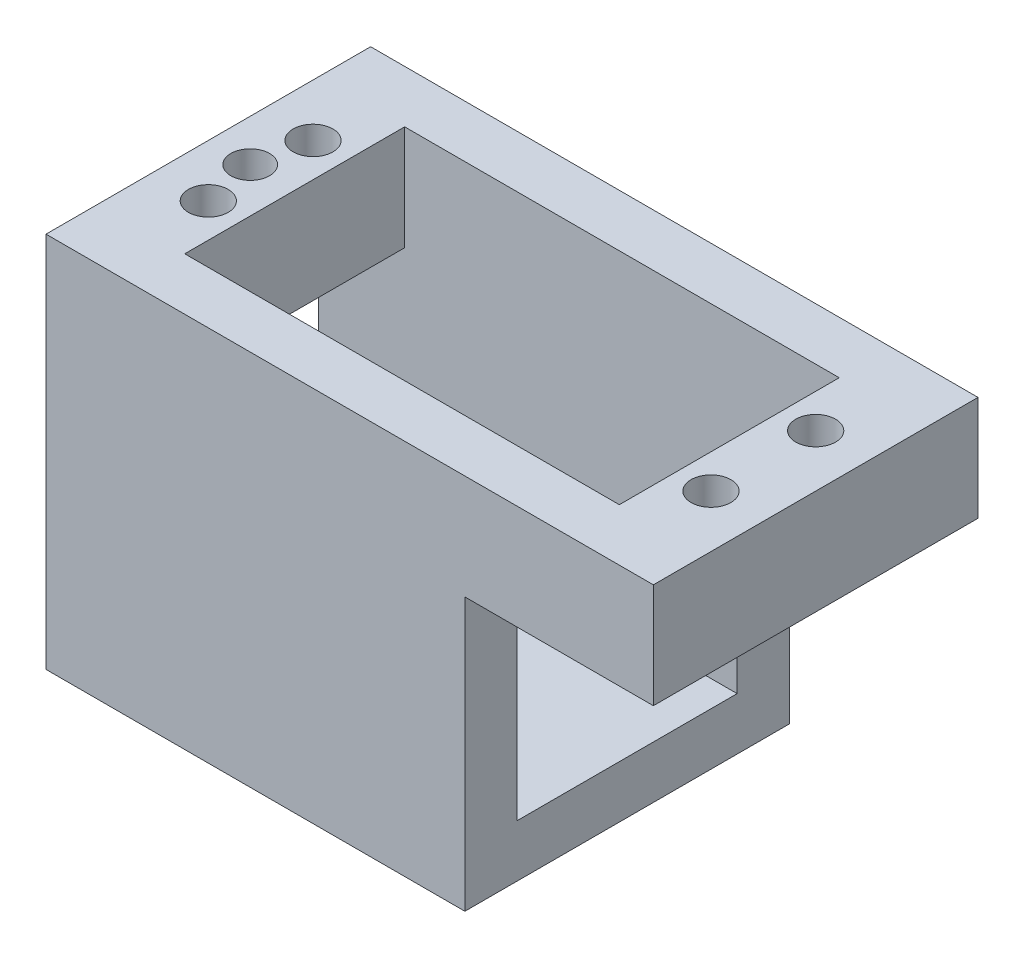
ISO-10303-21;
HEADER;
FILE_DESCRIPTION(('STEP AP214'),'2;1');
FILE_NAME('part.step','',(''),(''),'','','');
FILE_SCHEMA(('AUTOMOTIVE_DESIGN { 1 0 10303 214 1 1 1 1 }'));
ENDSEC;
DATA;
#1=APPLICATION_CONTEXT('core data for automotive mechanical design processes');
#2=APPLICATION_PROTOCOL_DEFINITION('international standard','automotive_design',2000,#1);
#3=PRODUCT_CONTEXT('',#1,'mechanical');
#4=PRODUCT('Part','Part','',(#3));
#5=PRODUCT_RELATED_PRODUCT_CATEGORY('part','',(#4));
#6=PRODUCT_DEFINITION_FORMATION('','',#4);
#7=PRODUCT_DEFINITION_CONTEXT('part definition',#1,'design');
#8=PRODUCT_DEFINITION('design','',#6,#7);
#9=PRODUCT_DEFINITION_SHAPE('','',#8);
#10=(LENGTH_UNIT() NAMED_UNIT(*) SI_UNIT(.MILLI.,.METRE.));
#11=(NAMED_UNIT(*) PLANE_ANGLE_UNIT() SI_UNIT($,.RADIAN.));
#12=(NAMED_UNIT(*) SI_UNIT($,.STERADIAN.) SOLID_ANGLE_UNIT());
#13=UNCERTAINTY_MEASURE_WITH_UNIT(LENGTH_MEASURE(1.E-05),#10,'distance_accuracy_value','');
#14=(GEOMETRIC_REPRESENTATION_CONTEXT(3) GLOBAL_UNCERTAINTY_ASSIGNED_CONTEXT((#13)) GLOBAL_UNIT_ASSIGNED_CONTEXT((#10,
#11,#12)) REPRESENTATION_CONTEXT('',''));
#15=CARTESIAN_POINT('',(0.,0.,0.));
#16=DIRECTION('',(0.,0.,1.));
#17=DIRECTION('',(1.,0.,0.));
#18=AXIS2_PLACEMENT_3D('',#15,#16,#17);
#19=CARTESIAN_POINT('',(-15.,-21.2,0.));
#20=DIRECTION('',(0.,1.,0.));
#21=DIRECTION('',(0.,0.,1.));
#22=AXIS2_PLACEMENT_3D('',#19,#20,#21);
#23=CYLINDRICAL_SURFACE('',#22,3.05);
#24=CARTESIAN_POINT('',(-15.,-21.2,0.));
#25=DIRECTION('',(0.,1.,0.));
#26=DIRECTION('',(0.,0.,1.));
#27=AXIS2_PLACEMENT_3D('',#24,#25,#26);
#28=CIRCLE('',#27,3.05);
#29=CARTESIAN_POINT('',(-15.,-21.2,3.05));
#30=VERTEX_POINT('',#29);
#31=EDGE_CURVE('E11',#30,#30,#28,.T.);
#32=ORIENTED_EDGE('',*,*,#31,.T.);
#33=EDGE_LOOP('',(#32));
#34=FACE_BOUND('',#33,.T.);
#35=CARTESIAN_POINT('',(-15.,-21.,0.));
#36=DIRECTION('',(0.,1.,0.));
#37=DIRECTION('',(0.,0.,1.));
#38=AXIS2_PLACEMENT_3D('',#35,#36,#37);
#39=CIRCLE('',#38,3.05);
#40=CARTESIAN_POINT('',(-15.,-21.,3.05));
#41=VERTEX_POINT('',#40);
#42=EDGE_CURVE('E47',#41,#41,#39,.T.);
#43=ORIENTED_EDGE('',*,*,#42,.F.);
#44=EDGE_LOOP('',(#43));
#45=FACE_BOUND('',#44,.T.);
#46=ADVANCED_FACE('F44',(#34,#45),#23,.T.);
#47=CARTESIAN_POINT('',(-15.,-21.2,0.));
#48=DIRECTION('',(0.,1.,0.));
#49=DIRECTION('',(0.,0.,1.));
#50=AXIS2_PLACEMENT_3D('',#47,#48,#49);
#51=PLANE('',#50);
#52=ORIENTED_EDGE('',*,*,#31,.F.);
#53=EDGE_LOOP('',(#52));
#54=FACE_BOUND('',#53,.T.);
#55=ADVANCED_FACE('F61',(#54),#51,.F.);
#56=CARTESIAN_POINT('',(-15.,-21.,0.));
#57=DIRECTION('',(0.,1.,0.));
#58=DIRECTION('',(0.,0.,1.));
#59=AXIS2_PLACEMENT_3D('',#56,#57,#58);
#60=PLANE('',#59);
#61=ORIENTED_EDGE('',*,*,#42,.T.);
#62=EDGE_LOOP('',(#61));
#63=FACE_BOUND('',#62,.T.);
#64=ADVANCED_FACE('F58',(#63),#60,.T.);
#65=CLOSED_SHELL('',(#46,#55,#64));
#66=MANIFOLD_SOLID_BREP('B2',#65);
#67=CARTESIAN_POINT('',(-25.,-21.2,0.));
#68=DIRECTION('',(0.,1.,0.));
#69=DIRECTION('',(0.,0.,1.));
#70=AXIS2_PLACEMENT_3D('',#67,#68,#69);
#71=CYLINDRICAL_SURFACE('',#70,3.05);
#72=CARTESIAN_POINT('',(-25.,-21.2,0.));
#73=DIRECTION('',(0.,1.,0.));
#74=DIRECTION('',(0.,0.,1.));
#75=AXIS2_PLACEMENT_3D('',#72,#73,#74);
#76=CIRCLE('',#75,3.05);
#77=CARTESIAN_POINT('',(-25.,-21.2,3.05));
#78=VERTEX_POINT('',#77);
#79=EDGE_CURVE('E43',#78,#78,#76,.T.);
#80=ORIENTED_EDGE('',*,*,#79,.T.);
#81=EDGE_LOOP('',(#80));
#82=FACE_BOUND('',#81,.T.);
#83=CARTESIAN_POINT('',(-25.,-21.,0.));
#84=DIRECTION('',(0.,1.,0.));
#85=DIRECTION('',(0.,0.,1.));
#86=AXIS2_PLACEMENT_3D('',#83,#84,#85);
#87=CIRCLE('',#86,3.05);
#88=CARTESIAN_POINT('',(-25.,-21.,3.05));
#89=VERTEX_POINT('',#88);
#90=EDGE_CURVE('E102',#89,#89,#87,.T.);
#91=ORIENTED_EDGE('',*,*,#90,.F.);
#92=EDGE_LOOP('',(#91));
#93=FACE_BOUND('',#92,.T.);
#94=ADVANCED_FACE('F99',(#82,#93),#71,.T.);
#95=CARTESIAN_POINT('',(-25.,-21.2,0.));
#96=DIRECTION('',(0.,1.,0.));
#97=DIRECTION('',(0.,0.,1.));
#98=AXIS2_PLACEMENT_3D('',#95,#96,#97);
#99=PLANE('',#98);
#100=ORIENTED_EDGE('',*,*,#79,.F.);
#101=EDGE_LOOP('',(#100));
#102=FACE_BOUND('',#101,.T.);
#103=ADVANCED_FACE('F116',(#102),#99,.F.);
#104=CARTESIAN_POINT('',(-25.,-21.,0.));
#105=DIRECTION('',(0.,1.,0.));
#106=DIRECTION('',(0.,0.,1.));
#107=AXIS2_PLACEMENT_3D('',#104,#105,#106);
#108=PLANE('',#107);
#109=ORIENTED_EDGE('',*,*,#90,.T.);
#110=EDGE_LOOP('',(#109));
#111=FACE_BOUND('',#110,.T.);
#112=ADVANCED_FACE('F113',(#111),#108,.T.);
#113=CLOSED_SHELL('',(#94,#103,#112));
#114=MANIFOLD_SOLID_BREP('B6',#113);
#115=CARTESIAN_POINT('',(-15.,-33.2,0.));
#116=DIRECTION('',(0.,1.,0.));
#117=DIRECTION('',(0.,0.,1.));
#118=AXIS2_PLACEMENT_3D('',#115,#116,#117);
#119=CYLINDRICAL_SURFACE('',#118,1.85);
#120=CARTESIAN_POINT('',(-15.,-33.2,0.));
#121=DIRECTION('',(0.,-1.,0.));
#122=DIRECTION('',(0.,0.,-1.));
#123=AXIS2_PLACEMENT_3D('',#120,#121,#122);
#124=CIRCLE('',#123,1.85);
#125=CARTESIAN_POINT('',(-15.,-33.2,-1.85));
#126=VERTEX_POINT('',#125);
#127=EDGE_CURVE('E523',#126,#126,#124,.T.);
#128=ORIENTED_EDGE('',*,*,#127,.T.);
#129=EDGE_LOOP('',(#128));
#130=FACE_BOUND('',#129,.T.);
#131=CARTESIAN_POINT('',(-15.,-24.5,0.));
#132=DIRECTION('',(0.,1.,0.));
#133=DIRECTION('',(0.,0.,1.));
#134=AXIS2_PLACEMENT_3D('',#131,#132,#133);
#135=CIRCLE('',#134,1.85);
#136=CARTESIAN_POINT('',(-15.,-24.5,1.85));
#137=VERTEX_POINT('',#136);
#138=EDGE_CURVE('E149',#137,#137,#135,.T.);
#139=ORIENTED_EDGE('',*,*,#138,.T.);
#140=EDGE_LOOP('',(#139));
#141=FACE_BOUND('',#140,.T.);
#142=ADVANCED_FACE('F145',(#130,#141),#119,.F.);
#143=CARTESIAN_POINT('',(-25.,-33.2,0.));
#144=DIRECTION('',(0.,1.,0.));
#145=DIRECTION('',(0.,0.,1.));
#146=AXIS2_PLACEMENT_3D('',#143,#144,#145);
#147=CYLINDRICAL_SURFACE('',#146,1.85);
#148=CARTESIAN_POINT('',(-25.,-33.2,0.));
#149=DIRECTION('',(0.,-1.,0.));
#150=DIRECTION('',(0.,0.,-1.));
#151=AXIS2_PLACEMENT_3D('',#148,#149,#150);
#152=CIRCLE('',#151,1.85);
#153=CARTESIAN_POINT('',(-25.,-33.2,-1.85));
#154=VERTEX_POINT('',#153);
#155=EDGE_CURVE('E519',#154,#154,#152,.T.);
#156=ORIENTED_EDGE('',*,*,#155,.T.);
#157=EDGE_LOOP('',(#156));
#158=FACE_BOUND('',#157,.T.);
#159=CARTESIAN_POINT('',(-25.,-24.5,0.));
#160=DIRECTION('',(0.,1.,0.));
#161=DIRECTION('',(0.,0.,1.));
#162=AXIS2_PLACEMENT_3D('',#159,#160,#161);
#163=CIRCLE('',#162,1.85);
#164=CARTESIAN_POINT('',(-25.,-24.5,1.85));
#165=VERTEX_POINT('',#164);
#166=EDGE_CURVE('E485',#165,#165,#163,.T.);
#167=ORIENTED_EDGE('',*,*,#166,.T.);
#168=EDGE_LOOP('',(#167));
#169=FACE_BOUND('',#168,.T.);
#170=ADVANCED_FACE('F579',(#158,#169),#147,.F.);
#171=CARTESIAN_POINT('',(0.,0.,0.));
#172=DIRECTION('',(0.,1.,0.));
#173=DIRECTION('',(0.,0.,1.));
#174=AXIS2_PLACEMENT_3D('',#171,#172,#173);
#175=PLANE('',#174);
#176=CARTESIAN_POINT('',(24.,0.,-5.));
#177=DIRECTION('',(0.,1.,0.));
#178=DIRECTION('',(0.,0.,1.));
#179=AXIS2_PLACEMENT_3D('',#176,#177,#178);
#180=CIRCLE('',#179,1.9);
#181=CARTESIAN_POINT('',(24.,0.,-3.1));
#182=VERTEX_POINT('',#181);
#183=EDGE_CURVE('E422',#182,#182,#180,.T.);
#184=ORIENTED_EDGE('',*,*,#183,.T.);
#185=EDGE_LOOP('',(#184));
#186=FACE_BOUND('',#185,.T.);
#187=CARTESIAN_POINT('',(24.,0.,5.));
#188=DIRECTION('',(0.,1.,0.));
#189=DIRECTION('',(0.,0.,1.));
#190=AXIS2_PLACEMENT_3D('',#187,#188,#189);
#191=CIRCLE('',#190,1.9);
#192=CARTESIAN_POINT('',(24.,0.,6.9));
#193=VERTEX_POINT('',#192);
#194=EDGE_CURVE('E430',#193,#193,#191,.T.);
#195=ORIENTED_EDGE('',*,*,#194,.T.);
#196=EDGE_LOOP('',(#195));
#197=FACE_BOUND('',#196,.T.);
#198=DIRECTION('',(0.,0.,1.));
#199=VECTOR('',#198,1.);
#200=CARTESIAN_POINT('',(11.,0.,-10.5));
#201=LINE('',#200,#199);
#202=CARTESIAN_POINT('',(11.,0.,-15.5));
#203=VERTEX_POINT('',#202);
#204=CARTESIAN_POINT('',(11.,0.,-10.5));
#205=VERTEX_POINT('',#204);
#206=EDGE_CURVE('E325',#203,#205,#201,.T.);
#207=ORIENTED_EDGE('',*,*,#206,.F.);
#208=DIRECTION('',(-1.,0.,0.));
#209=VECTOR('',#208,1.);
#210=CARTESIAN_POINT('',(-29.,0.,-15.5));
#211=LINE('',#210,#209);
#212=CARTESIAN_POINT('',(29.,0.,-15.5));
#213=VERTEX_POINT('',#212);
#214=EDGE_CURVE('E468',#213,#203,#211,.T.);
#215=ORIENTED_EDGE('',*,*,#214,.F.);
#216=DIRECTION('',(0.,0.,-1.));
#217=VECTOR('',#216,1.);
#218=CARTESIAN_POINT('',(29.,0.,-15.5));
#219=LINE('',#218,#217);
#220=CARTESIAN_POINT('',(29.,0.,15.5));
#221=VERTEX_POINT('',#220);
#222=EDGE_CURVE('E446',#221,#213,#219,.T.);
#223=ORIENTED_EDGE('',*,*,#222,.F.);
#224=DIRECTION('',(1.,0.,0.));
#225=VECTOR('',#224,1.);
#226=CARTESIAN_POINT('',(-29.,0.,15.5));
#227=LINE('',#226,#225);
#228=CARTESIAN_POINT('',(11.,0.,15.5));
#229=VERTEX_POINT('',#228);
#230=EDGE_CURVE('E455',#229,#221,#227,.T.);
#231=ORIENTED_EDGE('',*,*,#230,.F.);
#232=DIRECTION('',(0.,0.,1.));
#233=VECTOR('',#232,1.);
#234=CARTESIAN_POINT('',(11.,0.,15.5));
#235=LINE('',#234,#233);
#236=CARTESIAN_POINT('',(11.,0.,10.5));
#237=VERTEX_POINT('',#236);
#238=EDGE_CURVE('E359',#237,#229,#235,.T.);
#239=ORIENTED_EDGE('',*,*,#238,.F.);
#240=DIRECTION('',(1.,0.,0.));
#241=VECTOR('',#240,1.);
#242=CARTESIAN_POINT('',(-20.75,0.,10.5));
#243=LINE('',#242,#241);
#244=CARTESIAN_POINT('',(20.75,0.,10.5));
#245=VERTEX_POINT('',#244);
#246=EDGE_CURVE('E382',#237,#245,#243,.T.);
#247=ORIENTED_EDGE('',*,*,#246,.T.);
#248=DIRECTION('',(0.,0.,-1.));
#249=VECTOR('',#248,1.);
#250=CARTESIAN_POINT('',(20.75,0.,-10.5));
#251=LINE('',#250,#249);
#252=CARTESIAN_POINT('',(20.75,0.,-10.5));
#253=VERTEX_POINT('',#252);
#254=EDGE_CURVE('E377',#245,#253,#251,.T.);
#255=ORIENTED_EDGE('',*,*,#254,.T.);
#256=DIRECTION('',(-1.,0.,0.));
#257=VECTOR('',#256,1.);
#258=CARTESIAN_POINT('',(-20.75,0.,-10.5));
#259=LINE('',#258,#257);
#260=EDGE_CURVE('E396',#253,#205,#259,.T.);
#261=ORIENTED_EDGE('',*,*,#260,.T.);
#262=EDGE_LOOP('',(#207,#215,#223,#231,#239,#247,#255,#261));
#263=FACE_BOUND('',#262,.T.);
#264=ADVANCED_FACE('F585',(#186,#197,#263),#175,.F.);
#265=CARTESIAN_POINT('',(-25.,0.,0.));
#266=DIRECTION('',(0.,1.,0.));
#267=DIRECTION('',(0.,0.,1.));
#268=AXIS2_PLACEMENT_3D('',#265,#266,#267);
#269=CIRCLE('',#268,1.85);
#270=CARTESIAN_POINT('',(-25.,0.,-1.85));
#271=VERTEX_POINT('',#270);
#272=EDGE_CURVE('E515',#271,#271,#269,.T.);
#273=ORIENTED_EDGE('',*,*,#272,.T.);
#274=EDGE_LOOP('',(#273));
#275=FACE_BOUND('',#274,.T.);
#276=CARTESIAN_POINT('',(-24.,0.,-5.));
#277=DIRECTION('',(0.,1.,0.));
#278=DIRECTION('',(0.,0.,1.));
#279=AXIS2_PLACEMENT_3D('',#276,#277,#278);
#280=CIRCLE('',#279,1.9);
#281=CARTESIAN_POINT('',(-24.,0.,-3.1));
#282=VERTEX_POINT('',#281);
#283=EDGE_CURVE('E417',#282,#282,#280,.T.);
#284=ORIENTED_EDGE('',*,*,#283,.T.);
#285=EDGE_LOOP('',(#284));
#286=FACE_BOUND('',#285,.T.);
#287=CARTESIAN_POINT('',(-24.,0.,5.));
#288=DIRECTION('',(0.,1.,0.));
#289=DIRECTION('',(0.,0.,1.));
#290=AXIS2_PLACEMENT_3D('',#287,#288,#289);
#291=CIRCLE('',#290,1.9);
#292=CARTESIAN_POINT('',(-24.,0.,6.9));
#293=VERTEX_POINT('',#292);
#294=EDGE_CURVE('E438',#293,#293,#291,.T.);
#295=ORIENTED_EDGE('',*,*,#294,.T.);
#296=EDGE_LOOP('',(#295));
#297=FACE_BOUND('',#296,.T.);
#298=DIRECTION('',(-1.,0.,0.));
#299=VECTOR('',#298,1.);
#300=CARTESIAN_POINT('',(-29.,0.,-10.5));
#301=LINE('',#300,#299);
#302=CARTESIAN_POINT('',(-20.75,0.,-10.5));
#303=VERTEX_POINT('',#302);
#304=CARTESIAN_POINT('',(-29.,0.,-10.5));
#305=VERTEX_POINT('',#304);
#306=EDGE_CURVE('E335',#303,#305,#301,.T.);
#307=ORIENTED_EDGE('',*,*,#306,.F.);
#308=DIRECTION('',(0.,0.,1.));
#309=VECTOR('',#308,1.);
#310=CARTESIAN_POINT('',(-20.75,0.,-10.5));
#311=LINE('',#310,#309);
#312=CARTESIAN_POINT('',(-20.75,0.,10.5));
#313=VERTEX_POINT('',#312);
#314=EDGE_CURVE('E398',#303,#313,#311,.T.);
#315=ORIENTED_EDGE('',*,*,#314,.T.);
#316=DIRECTION('',(1.,0.,0.));
#317=VECTOR('',#316,1.);
#318=CARTESIAN_POINT('',(-29.,0.,10.5));
#319=LINE('',#318,#317);
#320=CARTESIAN_POINT('',(-29.,0.,10.5));
#321=VERTEX_POINT('',#320);
#322=EDGE_CURVE('E353',#321,#313,#319,.T.);
#323=ORIENTED_EDGE('',*,*,#322,.F.);
#324=DIRECTION('',(0.,0.,1.));
#325=VECTOR('',#324,1.);
#326=CARTESIAN_POINT('',(-29.,0.,-15.5));
#327=LINE('',#326,#325);
#328=EDGE_CURVE('E472',#305,#321,#327,.T.);
#329=ORIENTED_EDGE('',*,*,#328,.F.);
#330=EDGE_LOOP('',(#307,#315,#323,#329));
#331=FACE_BOUND('',#330,.T.);
#332=ADVANCED_FACE('F643',(#275,#286,#297,#331),#175,.F.);
#333=CARTESIAN_POINT('',(0.,10.,0.));
#334=DIRECTION('',(0.,1.,0.));
#335=DIRECTION('',(0.,0.,1.));
#336=AXIS2_PLACEMENT_3D('',#333,#334,#335);
#337=PLANE('',#336);
#338=CARTESIAN_POINT('',(-25.,10.,0.));
#339=DIRECTION('',(0.,-1.,0.));
#340=DIRECTION('',(0.,0.,-1.));
#341=AXIS2_PLACEMENT_3D('',#338,#339,#340);
#342=CIRCLE('',#341,1.85);
#343=CARTESIAN_POINT('',(-25.,10.,-1.85));
#344=VERTEX_POINT('',#343);
#345=EDGE_CURVE('E493',#344,#344,#342,.T.);
#346=ORIENTED_EDGE('',*,*,#345,.T.);
#347=EDGE_LOOP('',(#346));
#348=FACE_BOUND('',#347,.T.);
#349=CARTESIAN_POINT('',(24.,10.,-5.));
#350=DIRECTION('',(0.,1.,0.));
#351=DIRECTION('',(0.,0.,1.));
#352=AXIS2_PLACEMENT_3D('',#349,#350,#351);
#353=CIRCLE('',#352,1.9);
#354=CARTESIAN_POINT('',(24.,10.,-3.1));
#355=VERTEX_POINT('',#354);
#356=EDGE_CURVE('E426',#355,#355,#353,.T.);
#357=ORIENTED_EDGE('',*,*,#356,.F.);
#358=EDGE_LOOP('',(#357));
#359=FACE_BOUND('',#358,.T.);
#360=CARTESIAN_POINT('',(-24.,10.,5.));
#361=DIRECTION('',(0.,1.,0.));
#362=DIRECTION('',(0.,0.,1.));
#363=AXIS2_PLACEMENT_3D('',#360,#361,#362);
#364=CIRCLE('',#363,1.9);
#365=CARTESIAN_POINT('',(-24.,10.,6.9));
#366=VERTEX_POINT('',#365);
#367=EDGE_CURVE('E442',#366,#366,#364,.T.);
#368=ORIENTED_EDGE('',*,*,#367,.F.);
#369=EDGE_LOOP('',(#368));
#370=FACE_BOUND('',#369,.T.);
#371=DIRECTION('',(0.,0.,-1.));
#372=VECTOR('',#371,1.);
#373=CARTESIAN_POINT('',(29.,10.,-15.5));
#374=LINE('',#373,#372);
#375=CARTESIAN_POINT('',(29.,10.,15.5));
#376=VERTEX_POINT('',#375);
#377=CARTESIAN_POINT('',(29.,10.,-15.5));
#378=VERTEX_POINT('',#377);
#379=EDGE_CURVE('E450',#376,#378,#374,.T.);
#380=ORIENTED_EDGE('',*,*,#379,.T.);
#381=DIRECTION('',(-1.,0.,0.));
#382=VECTOR('',#381,1.);
#383=CARTESIAN_POINT('',(-29.,10.,-15.5));
#384=LINE('',#383,#382);
#385=CARTESIAN_POINT('',(-29.,10.,-15.5));
#386=VERTEX_POINT('',#385);
#387=EDGE_CURVE('E454',#378,#386,#384,.T.);
#388=ORIENTED_EDGE('',*,*,#387,.T.);
#389=DIRECTION('',(0.,0.,1.));
#390=VECTOR('',#389,1.);
#391=CARTESIAN_POINT('',(-29.,10.,-15.5));
#392=LINE('',#391,#390);
#393=CARTESIAN_POINT('',(-29.,10.,15.5));
#394=VERTEX_POINT('',#393);
#395=EDGE_CURVE('E458',#386,#394,#392,.T.);
#396=ORIENTED_EDGE('',*,*,#395,.T.);
#397=DIRECTION('',(1.,0.,0.));
#398=VECTOR('',#397,1.);
#399=CARTESIAN_POINT('',(-29.,10.,15.5));
#400=LINE('',#399,#398);
#401=EDGE_CURVE('E461',#394,#376,#400,.T.);
#402=ORIENTED_EDGE('',*,*,#401,.T.);
#403=EDGE_LOOP('',(#380,#388,#396,#402));
#404=FACE_BOUND('',#403,.T.);
#405=CARTESIAN_POINT('',(24.,10.,5.));
#406=DIRECTION('',(0.,1.,0.));
#407=DIRECTION('',(0.,0.,1.));
#408=AXIS2_PLACEMENT_3D('',#405,#406,#407);
#409=CIRCLE('',#408,1.9);
#410=CARTESIAN_POINT('',(24.,10.,6.9));
#411=VERTEX_POINT('',#410);
#412=EDGE_CURVE('E434',#411,#411,#409,.T.);
#413=ORIENTED_EDGE('',*,*,#412,.F.);
#414=EDGE_LOOP('',(#413));
#415=FACE_BOUND('',#414,.T.);
#416=CARTESIAN_POINT('',(-24.,10.,-5.));
#417=DIRECTION('',(0.,1.,0.));
#418=DIRECTION('',(0.,0.,1.));
#419=AXIS2_PLACEMENT_3D('',#416,#417,#418);
#420=CIRCLE('',#419,1.9);
#421=CARTESIAN_POINT('',(-24.,10.,-3.1));
#422=VERTEX_POINT('',#421);
#423=EDGE_CURVE('E418',#422,#422,#420,.T.);
#424=ORIENTED_EDGE('',*,*,#423,.F.);
#425=EDGE_LOOP('',(#424));
#426=FACE_BOUND('',#425,.T.);
#427=DIRECTION('',(-1.,0.,0.));
#428=VECTOR('',#427,1.);
#429=CARTESIAN_POINT('',(-20.75,10.,-10.5));
#430=LINE('',#429,#428);
#431=CARTESIAN_POINT('',(20.75,10.,-10.5));
#432=VERTEX_POINT('',#431);
#433=CARTESIAN_POINT('',(-20.75,10.,-10.5));
#434=VERTEX_POINT('',#433);
#435=EDGE_CURVE('E381',#432,#434,#430,.T.);
#436=ORIENTED_EDGE('',*,*,#435,.F.);
#437=DIRECTION('',(0.,0.,-1.));
#438=VECTOR('',#437,1.);
#439=CARTESIAN_POINT('',(20.75,10.,-10.5));
#440=LINE('',#439,#438);
#441=CARTESIAN_POINT('',(20.75,10.,10.5));
#442=VERTEX_POINT('',#441);
#443=EDGE_CURVE('E378',#442,#432,#440,.T.);
#444=ORIENTED_EDGE('',*,*,#443,.F.);
#445=DIRECTION('',(1.,0.,0.));
#446=VECTOR('',#445,1.);
#447=CARTESIAN_POINT('',(-20.75,10.,10.5));
#448=LINE('',#447,#446);
#449=CARTESIAN_POINT('',(-20.75,10.,10.5));
#450=VERTEX_POINT('',#449);
#451=EDGE_CURVE('E389',#450,#442,#448,.T.);
#452=ORIENTED_EDGE('',*,*,#451,.F.);
#453=DIRECTION('',(0.,0.,1.));
#454=VECTOR('',#453,1.);
#455=CARTESIAN_POINT('',(-20.75,10.,-10.5));
#456=LINE('',#455,#454);
#457=EDGE_CURVE('E385',#434,#450,#456,.T.);
#458=ORIENTED_EDGE('',*,*,#457,.F.);
#459=EDGE_LOOP('',(#436,#444,#452,#458));
#460=FACE_BOUND('',#459,.T.);
#461=ADVANCED_FACE('F566',(#348,#359,#370,#404,#415,#426,#460),#337,.T.);
#462=CARTESIAN_POINT('',(29.,10.,-15.5));
#463=DIRECTION('',(-1.,0.,0.));
#464=DIRECTION('',(0.,0.,1.));
#465=AXIS2_PLACEMENT_3D('',#462,#463,#464);
#466=PLANE('',#465);
#467=ORIENTED_EDGE('',*,*,#222,.T.);
#468=DIRECTION('',(0.,-1.,0.));
#469=VECTOR('',#468,1.);
#470=CARTESIAN_POINT('',(29.,10.,-15.5));
#471=LINE('',#470,#469);
#472=EDGE_CURVE('E97',#378,#213,#471,.T.);
#473=ORIENTED_EDGE('',*,*,#472,.F.);
#474=ORIENTED_EDGE('',*,*,#379,.F.);
#475=DIRECTION('',(0.,-1.,0.));
#476=VECTOR('',#475,1.);
#477=CARTESIAN_POINT('',(29.,10.,15.5));
#478=LINE('',#477,#476);
#479=EDGE_CURVE('E464',#376,#221,#478,.T.);
#480=ORIENTED_EDGE('',*,*,#479,.T.);
#481=EDGE_LOOP('',(#467,#473,#474,#480));
#482=FACE_BOUND('',#481,.T.);
#483=ADVANCED_FACE('F147',(#482),#466,.F.);
#484=CARTESIAN_POINT('',(-29.,10.,-15.5));
#485=DIRECTION('',(0.,0.,1.));
#486=DIRECTION('',(1.,0.,0.));
#487=AXIS2_PLACEMENT_3D('',#484,#485,#486);
#488=PLANE('',#487);
#489=ORIENTED_EDGE('',*,*,#214,.T.);
#490=DIRECTION('',(0.,1.,0.));
#491=VECTOR('',#490,1.);
#492=CARTESIAN_POINT('',(11.,-21.,-15.5));
#493=LINE('',#492,#491);
#494=CARTESIAN_POINT('',(11.,-26.,-15.5));
#495=VERTEX_POINT('',#494);
#496=EDGE_CURVE('E349',#495,#203,#493,.T.);
#497=ORIENTED_EDGE('',*,*,#496,.F.);
#498=DIRECTION('',(1.,0.,0.));
#499=VECTOR('',#498,1.);
#500=CARTESIAN_POINT('',(-29.,-26.,-15.5));
#501=LINE('',#500,#499);
#502=CARTESIAN_POINT('',(-29.,-26.,-15.5));
#503=VERTEX_POINT('',#502);
#504=EDGE_CURVE('E313',#503,#495,#501,.T.);
#505=ORIENTED_EDGE('',*,*,#504,.F.);
#506=DIRECTION('',(0.,-1.,0.));
#507=VECTOR('',#506,1.);
#508=CARTESIAN_POINT('',(-29.,10.,-15.5));
#509=LINE('',#508,#507);
#510=EDGE_CURVE('E155',#386,#503,#509,.T.);
#511=ORIENTED_EDGE('',*,*,#510,.F.);
#512=ORIENTED_EDGE('',*,*,#387,.F.);
#513=ORIENTED_EDGE('',*,*,#472,.T.);
#514=EDGE_LOOP('',(#489,#497,#505,#511,#512,#513));
#515=FACE_BOUND('',#514,.T.);
#516=ADVANCED_FACE('F569',(#515),#488,.F.);
#517=CARTESIAN_POINT('',(-29.,10.,-15.5));
#518=DIRECTION('',(1.,0.,0.));
#519=DIRECTION('',(0.,0.,-1.));
#520=AXIS2_PLACEMENT_3D('',#517,#518,#519);
#521=PLANE('',#520);
#522=DIRECTION('',(0.,1.,0.));
#523=VECTOR('',#522,1.);
#524=CARTESIAN_POINT('',(-29.,-21.,10.5));
#525=LINE('',#524,#523);
#526=CARTESIAN_POINT('',(-29.,-21.,10.5));
#527=VERTEX_POINT('',#526);
#528=EDGE_CURVE('E373',#527,#321,#525,.T.);
#529=ORIENTED_EDGE('',*,*,#528,.F.);
#530=DIRECTION('',(0.,0.,-1.));
#531=VECTOR('',#530,1.);
#532=CARTESIAN_POINT('',(-29.,-21.,15.5));
#533=LINE('',#532,#531);
#534=CARTESIAN_POINT('',(-29.,-21.,-10.5));
#535=VERTEX_POINT('',#534);
#536=EDGE_CURVE('E297',#527,#535,#533,.T.);
#537=ORIENTED_EDGE('',*,*,#536,.T.);
#538=DIRECTION('',(0.,1.,0.));
#539=VECTOR('',#538,1.);
#540=CARTESIAN_POINT('',(-29.,-21.,-10.5));
#541=LINE('',#540,#539);
#542=EDGE_CURVE('E334',#535,#305,#541,.T.);
#543=ORIENTED_EDGE('',*,*,#542,.T.);
#544=ORIENTED_EDGE('',*,*,#328,.T.);
#545=EDGE_LOOP('',(#529,#537,#543,#544));
#546=FACE_BOUND('',#545,.T.);
#547=ORIENTED_EDGE('',*,*,#510,.T.);
#548=DIRECTION('',(0.,0.,-1.));
#549=VECTOR('',#548,1.);
#550=CARTESIAN_POINT('',(-29.,-26.,15.5));
#551=LINE('',#550,#549);
#552=CARTESIAN_POINT('',(-29.,-26.,-4.));
#553=VERTEX_POINT('',#552);
#554=EDGE_CURVE('E314',#553,#503,#551,.T.);
#555=ORIENTED_EDGE('',*,*,#554,.F.);
#556=DIRECTION('',(0.,1.,0.));
#557=VECTOR('',#556,1.);
#558=CARTESIAN_POINT('',(-29.,-33.2,-4.));
#559=LINE('',#558,#557);
#560=CARTESIAN_POINT('',(-29.,-33.2,-4.));
#561=VERTEX_POINT('',#560);
#562=EDGE_CURVE('E306',#561,#553,#559,.T.);
#563=ORIENTED_EDGE('',*,*,#562,.F.);
#564=DIRECTION('',(0.,0.,-1.));
#565=VECTOR('',#564,1.);
#566=CARTESIAN_POINT('',(-29.,-33.2,4.));
#567=LINE('',#566,#565);
#568=CARTESIAN_POINT('',(-29.,-33.2,4.));
#569=VERTEX_POINT('',#568);
#570=EDGE_CURVE('E281',#569,#561,#567,.T.);
#571=ORIENTED_EDGE('',*,*,#570,.F.);
#572=DIRECTION('',(0.,1.,0.));
#573=VECTOR('',#572,1.);
#574=CARTESIAN_POINT('',(-29.,-33.2,4.));
#575=LINE('',#574,#573);
#576=CARTESIAN_POINT('',(-29.,-26.,4.));
#577=VERTEX_POINT('',#576);
#578=EDGE_CURVE('E277',#569,#577,#575,.T.);
#579=ORIENTED_EDGE('',*,*,#578,.T.);
#580=CARTESIAN_POINT('',(-29.,-26.,15.5));
#581=VERTEX_POINT('',#580);
#582=EDGE_CURVE('E310',#581,#577,#551,.T.);
#583=ORIENTED_EDGE('',*,*,#582,.F.);
#584=DIRECTION('',(0.,-1.,0.));
#585=VECTOR('',#584,1.);
#586=CARTESIAN_POINT('',(-29.,10.,15.5));
#587=LINE('',#586,#585);
#588=EDGE_CURVE('E480',#394,#581,#587,.T.);
#589=ORIENTED_EDGE('',*,*,#588,.F.);
#590=ORIENTED_EDGE('',*,*,#395,.F.);
#591=EDGE_LOOP('',(#547,#555,#563,#571,#579,#583,#589,#590));
#592=FACE_BOUND('',#591,.T.);
#593=ADVANCED_FACE('F546',(#546,#592),#521,.F.);
#594=CARTESIAN_POINT('',(-29.,10.,15.5));
#595=DIRECTION('',(0.,0.,-1.));
#596=DIRECTION('',(-1.,0.,0.));
#597=AXIS2_PLACEMENT_3D('',#594,#595,#596);
#598=PLANE('',#597);
#599=ORIENTED_EDGE('',*,*,#588,.T.);
#600=DIRECTION('',(-1.,0.,0.));
#601=VECTOR('',#600,1.);
#602=CARTESIAN_POINT('',(-29.,-26.,15.5));
#603=LINE('',#602,#601);
#604=CARTESIAN_POINT('',(11.,-26.,15.5));
#605=VERTEX_POINT('',#604);
#606=EDGE_CURVE('E322',#605,#581,#603,.T.);
#607=ORIENTED_EDGE('',*,*,#606,.F.);
#608=DIRECTION('',(0.,1.,0.));
#609=VECTOR('',#608,1.);
#610=CARTESIAN_POINT('',(11.,-21.,15.5));
#611=LINE('',#610,#609);
#612=EDGE_CURVE('E358',#605,#229,#611,.T.);
#613=ORIENTED_EDGE('',*,*,#612,.T.);
#614=ORIENTED_EDGE('',*,*,#230,.T.);
#615=ORIENTED_EDGE('',*,*,#479,.F.);
#616=ORIENTED_EDGE('',*,*,#401,.F.);
#617=EDGE_LOOP('',(#599,#607,#613,#614,#615,#616));
#618=FACE_BOUND('',#617,.T.);
#619=ADVANCED_FACE('F559',(#618),#598,.F.);
#620=CARTESIAN_POINT('',(-24.,10.,5.));
#621=DIRECTION('',(0.,-1.,0.));
#622=DIRECTION('',(0.,0.,-1.));
#623=AXIS2_PLACEMENT_3D('',#620,#621,#622);
#624=CYLINDRICAL_SURFACE('',#623,1.9);
#625=ORIENTED_EDGE('',*,*,#367,.T.);
#626=EDGE_LOOP('',(#625));
#627=FACE_BOUND('',#626,.T.);
#628=ORIENTED_EDGE('',*,*,#294,.F.);
#629=EDGE_LOOP('',(#628));
#630=FACE_BOUND('',#629,.T.);
#631=ADVANCED_FACE('F636',(#627,#630),#624,.F.);
#632=CARTESIAN_POINT('',(24.,10.,5.));
#633=DIRECTION('',(0.,-1.,0.));
#634=DIRECTION('',(0.,0.,-1.));
#635=AXIS2_PLACEMENT_3D('',#632,#633,#634);
#636=CYLINDRICAL_SURFACE('',#635,1.9);
#637=ORIENTED_EDGE('',*,*,#412,.T.);
#638=EDGE_LOOP('',(#637));
#639=FACE_BOUND('',#638,.T.);
#640=ORIENTED_EDGE('',*,*,#194,.F.);
#641=EDGE_LOOP('',(#640));
#642=FACE_BOUND('',#641,.T.);
#643=ADVANCED_FACE('F632',(#639,#642),#636,.F.);
#644=CARTESIAN_POINT('',(24.,10.,-5.));
#645=DIRECTION('',(0.,-1.,0.));
#646=DIRECTION('',(0.,0.,-1.));
#647=AXIS2_PLACEMENT_3D('',#644,#645,#646);
#648=CYLINDRICAL_SURFACE('',#647,1.9);
#649=ORIENTED_EDGE('',*,*,#356,.T.);
#650=EDGE_LOOP('',(#649));
#651=FACE_BOUND('',#650,.T.);
#652=ORIENTED_EDGE('',*,*,#183,.F.);
#653=EDGE_LOOP('',(#652));
#654=FACE_BOUND('',#653,.T.);
#655=ADVANCED_FACE('F628',(#651,#654),#648,.F.);
#656=CARTESIAN_POINT('',(-24.,10.,-5.));
#657=DIRECTION('',(0.,-1.,0.));
#658=DIRECTION('',(0.,0.,-1.));
#659=AXIS2_PLACEMENT_3D('',#656,#657,#658);
#660=CYLINDRICAL_SURFACE('',#659,1.9);
#661=ORIENTED_EDGE('',*,*,#423,.T.);
#662=EDGE_LOOP('',(#661));
#663=FACE_BOUND('',#662,.T.);
#664=ORIENTED_EDGE('',*,*,#283,.F.);
#665=EDGE_LOOP('',(#664));
#666=FACE_BOUND('',#665,.T.);
#667=ADVANCED_FACE('F624',(#663,#666),#660,.F.);
#668=CARTESIAN_POINT('',(20.75,10.,-10.5));
#669=DIRECTION('',(-1.,0.,0.));
#670=DIRECTION('',(0.,0.,1.));
#671=AXIS2_PLACEMENT_3D('',#668,#669,#670);
#672=PLANE('',#671);
#673=ORIENTED_EDGE('',*,*,#254,.F.);
#674=DIRECTION('',(0.,-1.,0.));
#675=VECTOR('',#674,1.);
#676=CARTESIAN_POINT('',(20.75,10.,10.5));
#677=LINE('',#676,#675);
#678=EDGE_CURVE('E392',#442,#245,#677,.T.);
#679=ORIENTED_EDGE('',*,*,#678,.F.);
#680=ORIENTED_EDGE('',*,*,#443,.T.);
#681=DIRECTION('',(0.,-1.,0.));
#682=VECTOR('',#681,1.);
#683=CARTESIAN_POINT('',(20.75,10.,-10.5));
#684=LINE('',#683,#682);
#685=EDGE_CURVE('E413',#432,#253,#684,.T.);
#686=ORIENTED_EDGE('',*,*,#685,.T.);
#687=EDGE_LOOP('',(#673,#679,#680,#686));
#688=FACE_BOUND('',#687,.T.);
#689=ADVANCED_FACE('F620',(#688),#672,.T.);
#690=CARTESIAN_POINT('',(-20.75,10.,-10.5));
#691=DIRECTION('',(0.,0.,1.));
#692=DIRECTION('',(1.,0.,0.));
#693=AXIS2_PLACEMENT_3D('',#690,#691,#692);
#694=PLANE('',#693);
#695=ORIENTED_EDGE('',*,*,#260,.F.);
#696=ORIENTED_EDGE('',*,*,#685,.F.);
#697=ORIENTED_EDGE('',*,*,#435,.T.);
#698=DIRECTION('',(0.,-1.,0.));
#699=VECTOR('',#698,1.);
#700=CARTESIAN_POINT('',(-20.75,10.,-10.5));
#701=LINE('',#700,#699);
#702=EDGE_CURVE('E410',#434,#303,#701,.T.);
#703=ORIENTED_EDGE('',*,*,#702,.T.);
#704=ORIENTED_EDGE('',*,*,#306,.T.);
#705=ORIENTED_EDGE('',*,*,#542,.F.);
#706=DIRECTION('',(-1.,0.,0.));
#707=VECTOR('',#706,1.);
#708=CARTESIAN_POINT('',(-29.,-21.,-10.5));
#709=LINE('',#708,#707);
#710=CARTESIAN_POINT('',(11.,-21.,-10.5));
#711=VERTEX_POINT('',#710);
#712=EDGE_CURVE('E330',#711,#535,#709,.T.);
#713=ORIENTED_EDGE('',*,*,#712,.F.);
#714=DIRECTION('',(0.,1.,0.));
#715=VECTOR('',#714,1.);
#716=CARTESIAN_POINT('',(11.,-21.,-10.5));
#717=LINE('',#716,#715);
#718=EDGE_CURVE('E345',#711,#205,#717,.T.);
#719=ORIENTED_EDGE('',*,*,#718,.T.);
#720=EDGE_LOOP('',(#695,#696,#697,#703,#704,#705,#713,#719));
#721=FACE_BOUND('',#720,.T.);
#722=ADVANCED_FACE('F616',(#721),#694,.T.);
#723=CARTESIAN_POINT('',(-20.75,10.,-10.5));
#724=DIRECTION('',(1.,0.,0.));
#725=DIRECTION('',(0.,0.,-1.));
#726=AXIS2_PLACEMENT_3D('',#723,#724,#725);
#727=PLANE('',#726);
#728=ORIENTED_EDGE('',*,*,#314,.F.);
#729=ORIENTED_EDGE('',*,*,#702,.F.);
#730=ORIENTED_EDGE('',*,*,#457,.T.);
#731=DIRECTION('',(0.,-1.,0.));
#732=VECTOR('',#731,1.);
#733=CARTESIAN_POINT('',(-20.75,10.,10.5));
#734=LINE('',#733,#732);
#735=EDGE_CURVE('E407',#450,#313,#734,.T.);
#736=ORIENTED_EDGE('',*,*,#735,.T.);
#737=EDGE_LOOP('',(#728,#729,#730,#736));
#738=FACE_BOUND('',#737,.T.);
#739=ADVANCED_FACE('F612',(#738),#727,.T.);
#740=CARTESIAN_POINT('',(-20.75,10.,10.5));
#741=DIRECTION('',(0.,0.,-1.));
#742=DIRECTION('',(-1.,0.,0.));
#743=AXIS2_PLACEMENT_3D('',#740,#741,#742);
#744=PLANE('',#743);
#745=ORIENTED_EDGE('',*,*,#246,.F.);
#746=DIRECTION('',(0.,1.,0.));
#747=VECTOR('',#746,1.);
#748=CARTESIAN_POINT('',(11.,-21.,10.5));
#749=LINE('',#748,#747);
#750=CARTESIAN_POINT('',(11.,-21.,10.5));
#751=VERTEX_POINT('',#750);
#752=EDGE_CURVE('E369',#751,#237,#749,.T.);
#753=ORIENTED_EDGE('',*,*,#752,.F.);
#754=DIRECTION('',(1.,0.,0.));
#755=VECTOR('',#754,1.);
#756=CARTESIAN_POINT('',(-29.,-21.,10.5));
#757=LINE('',#756,#755);
#758=EDGE_CURVE('E354',#527,#751,#757,.T.);
#759=ORIENTED_EDGE('',*,*,#758,.F.);
#760=ORIENTED_EDGE('',*,*,#528,.T.);
#761=ORIENTED_EDGE('',*,*,#322,.T.);
#762=ORIENTED_EDGE('',*,*,#735,.F.);
#763=ORIENTED_EDGE('',*,*,#451,.T.);
#764=ORIENTED_EDGE('',*,*,#678,.T.);
#765=EDGE_LOOP('',(#745,#753,#759,#760,#761,#762,#763,#764));
#766=FACE_BOUND('',#765,.T.);
#767=ADVANCED_FACE('F609',(#766),#744,.T.);
#768=CARTESIAN_POINT('',(11.,-21.,15.5));
#769=DIRECTION('',(-1.,0.,0.));
#770=DIRECTION('',(0.,0.,1.));
#771=AXIS2_PLACEMENT_3D('',#768,#769,#770);
#772=PLANE('',#771);
#773=ORIENTED_EDGE('',*,*,#238,.T.);
#774=ORIENTED_EDGE('',*,*,#612,.F.);
#775=DIRECTION('',(0.,0.,1.));
#776=VECTOR('',#775,1.);
#777=CARTESIAN_POINT('',(11.,-26.,15.5));
#778=LINE('',#777,#776);
#779=EDGE_CURVE('E318',#495,#605,#778,.T.);
#780=ORIENTED_EDGE('',*,*,#779,.F.);
#781=ORIENTED_EDGE('',*,*,#496,.T.);
#782=ORIENTED_EDGE('',*,*,#206,.T.);
#783=ORIENTED_EDGE('',*,*,#718,.F.);
#784=DIRECTION('',(0.,0.,1.));
#785=VECTOR('',#784,1.);
#786=CARTESIAN_POINT('',(11.,-21.,15.5));
#787=LINE('',#786,#785);
#788=EDGE_CURVE('E303',#711,#751,#787,.T.);
#789=ORIENTED_EDGE('',*,*,#788,.T.);
#790=ORIENTED_EDGE('',*,*,#752,.T.);
#791=EDGE_LOOP('',(#773,#774,#780,#781,#782,#783,#789,#790));
#792=FACE_BOUND('',#791,.T.);
#793=ADVANCED_FACE('F556',(#792),#772,.F.);
#794=CARTESIAN_POINT('',(0.,-26.,0.));
#795=DIRECTION('',(0.,-1.,0.));
#796=DIRECTION('',(0.,0.,-1.));
#797=AXIS2_PLACEMENT_3D('',#794,#795,#796);
#798=PLANE('',#797);
#799=DIRECTION('',(1.,0.,0.));
#800=VECTOR('',#799,1.);
#801=CARTESIAN_POINT('',(-29.,-26.,-4.));
#802=LINE('',#801,#800);
#803=CARTESIAN_POINT('',(-4.99999999999999,-26.,-4.));
#804=VERTEX_POINT('',#803);
#805=EDGE_CURVE('E293',#553,#804,#802,.T.);
#806=ORIENTED_EDGE('',*,*,#805,.F.);
#807=ORIENTED_EDGE('',*,*,#554,.T.);
#808=ORIENTED_EDGE('',*,*,#504,.T.);
#809=ORIENTED_EDGE('',*,*,#779,.T.);
#810=ORIENTED_EDGE('',*,*,#606,.T.);
#811=ORIENTED_EDGE('',*,*,#582,.T.);
#812=DIRECTION('',(-1.,0.,0.));
#813=VECTOR('',#812,1.);
#814=CARTESIAN_POINT('',(-29.,-26.,4.));
#815=LINE('',#814,#813);
#816=CARTESIAN_POINT('',(-4.99999999999999,-26.,4.));
#817=VERTEX_POINT('',#816);
#818=EDGE_CURVE('E168',#817,#577,#815,.T.);
#819=ORIENTED_EDGE('',*,*,#818,.F.);
#820=DIRECTION('',(0.,0.,1.));
#821=VECTOR('',#820,1.);
#822=CARTESIAN_POINT('',(-4.99999999999999,-26.,4.));
#823=LINE('',#822,#821);
#824=EDGE_CURVE('E163',#804,#817,#823,.T.);
#825=ORIENTED_EDGE('',*,*,#824,.F.);
#826=EDGE_LOOP('',(#806,#807,#808,#809,#810,#811,#819,#825));
#827=FACE_BOUND('',#826,.T.);
#828=ADVANCED_FACE('F551',(#827),#798,.T.);
#829=CARTESIAN_POINT('',(0.,-21.,0.));
#830=DIRECTION('',(0.,-1.,0.));
#831=DIRECTION('',(0.,0.,-1.));
#832=AXIS2_PLACEMENT_3D('',#829,#830,#831);
#833=PLANE('',#832);
#834=CARTESIAN_POINT('',(-25.,-21.,0.));
#835=DIRECTION('',(0.,1.,0.));
#836=DIRECTION('',(0.,0.,1.));
#837=AXIS2_PLACEMENT_3D('',#834,#835,#836);
#838=CIRCLE('',#837,3.);
#839=CARTESIAN_POINT('',(-25.,-21.,2.99999999999999));
#840=VERTEX_POINT('',#839);
#841=EDGE_CURVE('E496',#840,#840,#838,.T.);
#842=ORIENTED_EDGE('',*,*,#841,.F.);
#843=EDGE_LOOP('',(#842));
#844=FACE_BOUND('',#843,.T.);
#845=CARTESIAN_POINT('',(-15.,-21.,0.));
#846=DIRECTION('',(0.,1.,0.));
#847=DIRECTION('',(0.,0.,1.));
#848=AXIS2_PLACEMENT_3D('',#845,#846,#847);
#849=CIRCLE('',#848,3.);
#850=CARTESIAN_POINT('',(-15.,-21.,3.));
#851=VERTEX_POINT('',#850);
#852=EDGE_CURVE('E508',#851,#851,#849,.T.);
#853=ORIENTED_EDGE('',*,*,#852,.F.);
#854=EDGE_LOOP('',(#853));
#855=FACE_BOUND('',#854,.T.);
#856=ORIENTED_EDGE('',*,*,#712,.T.);
#857=ORIENTED_EDGE('',*,*,#536,.F.);
#858=ORIENTED_EDGE('',*,*,#758,.T.);
#859=ORIENTED_EDGE('',*,*,#788,.F.);
#860=EDGE_LOOP('',(#856,#857,#858,#859));
#861=FACE_BOUND('',#860,.T.);
#862=ADVANCED_FACE('F593',(#844,#855,#861),#833,.F.);
#863=CARTESIAN_POINT('',(0.,-33.2,0.));
#864=DIRECTION('',(0.,-1.,0.));
#865=DIRECTION('',(0.,0.,-1.));
#866=AXIS2_PLACEMENT_3D('',#863,#864,#865);
#867=PLANE('',#866);
#868=ORIENTED_EDGE('',*,*,#127,.F.);
#869=EDGE_LOOP('',(#868));
#870=FACE_BOUND('',#869,.T.);
#871=DIRECTION('',(0.,0.,1.));
#872=VECTOR('',#871,1.);
#873=CARTESIAN_POINT('',(-4.99999999999999,-33.2,4.));
#874=LINE('',#873,#872);
#875=CARTESIAN_POINT('',(-4.99999999999999,-33.2,-4.));
#876=VERTEX_POINT('',#875);
#877=CARTESIAN_POINT('',(-4.99999999999999,-33.2,4.));
#878=VERTEX_POINT('',#877);
#879=EDGE_CURVE('E282',#876,#878,#874,.T.);
#880=ORIENTED_EDGE('',*,*,#879,.T.);
#881=DIRECTION('',(-1.,0.,0.));
#882=VECTOR('',#881,1.);
#883=CARTESIAN_POINT('',(-29.,-33.2,4.));
#884=LINE('',#883,#882);
#885=EDGE_CURVE('E271',#878,#569,#884,.T.);
#886=ORIENTED_EDGE('',*,*,#885,.T.);
#887=ORIENTED_EDGE('',*,*,#570,.T.);
#888=DIRECTION('',(1.,0.,0.));
#889=VECTOR('',#888,1.);
#890=CARTESIAN_POINT('',(-29.,-33.2,-4.));
#891=LINE('',#890,#889);
#892=EDGE_CURVE('E288',#561,#876,#891,.T.);
#893=ORIENTED_EDGE('',*,*,#892,.T.);
#894=EDGE_LOOP('',(#880,#886,#887,#893));
#895=FACE_BOUND('',#894,.T.);
#896=ORIENTED_EDGE('',*,*,#155,.F.);
#897=EDGE_LOOP('',(#896));
#898=FACE_BOUND('',#897,.T.);
#899=ADVANCED_FACE('F285',(#870,#895,#898),#867,.T.);
#900=CARTESIAN_POINT('',(-4.99999999999999,-33.2,4.));
#901=DIRECTION('',(-1.,0.,0.));
#902=DIRECTION('',(0.,0.,1.));
#903=AXIS2_PLACEMENT_3D('',#900,#901,#902);
#904=PLANE('',#903);
#905=ORIENTED_EDGE('',*,*,#824,.T.);
#906=DIRECTION('',(0.,1.,0.));
#907=VECTOR('',#906,1.);
#908=CARTESIAN_POINT('',(-4.99999999999999,-33.2,4.));
#909=LINE('',#908,#907);
#910=EDGE_CURVE('E275',#878,#817,#909,.T.);
#911=ORIENTED_EDGE('',*,*,#910,.F.);
#912=ORIENTED_EDGE('',*,*,#879,.F.);
#913=DIRECTION('',(0.,1.,0.));
#914=VECTOR('',#913,1.);
#915=CARTESIAN_POINT('',(-4.99999999999999,-33.2,-4.));
#916=LINE('',#915,#914);
#917=EDGE_CURVE('E531',#876,#804,#916,.T.);
#918=ORIENTED_EDGE('',*,*,#917,.T.);
#919=EDGE_LOOP('',(#905,#911,#912,#918));
#920=FACE_BOUND('',#919,.T.);
#921=ADVANCED_FACE('F295',(#920),#904,.F.);
#922=CARTESIAN_POINT('',(-29.,-33.2,4.));
#923=DIRECTION('',(0.,0.,-1.));
#924=DIRECTION('',(-1.,0.,0.));
#925=AXIS2_PLACEMENT_3D('',#922,#923,#924);
#926=PLANE('',#925);
#927=ORIENTED_EDGE('',*,*,#818,.T.);
#928=ORIENTED_EDGE('',*,*,#578,.F.);
#929=ORIENTED_EDGE('',*,*,#885,.F.);
#930=ORIENTED_EDGE('',*,*,#910,.T.);
#931=EDGE_LOOP('',(#927,#928,#929,#930));
#932=FACE_BOUND('',#931,.T.);
#933=ADVANCED_FACE('F273',(#932),#926,.F.);
#934=CARTESIAN_POINT('',(-29.,-33.2,-4.));
#935=DIRECTION('',(0.,0.,1.));
#936=DIRECTION('',(1.,0.,0.));
#937=AXIS2_PLACEMENT_3D('',#934,#935,#936);
#938=PLANE('',#937);
#939=ORIENTED_EDGE('',*,*,#805,.T.);
#940=ORIENTED_EDGE('',*,*,#917,.F.);
#941=ORIENTED_EDGE('',*,*,#892,.F.);
#942=ORIENTED_EDGE('',*,*,#562,.T.);
#943=EDGE_LOOP('',(#939,#940,#941,#942));
#944=FACE_BOUND('',#943,.T.);
#945=ADVANCED_FACE('F543',(#944),#938,.F.);
#946=CARTESIAN_POINT('',(-25.,10.,0.));
#947=DIRECTION('',(0.,-1.,0.));
#948=DIRECTION('',(0.,0.,-1.));
#949=AXIS2_PLACEMENT_3D('',#946,#947,#948);
#950=CYLINDRICAL_SURFACE('',#949,1.85);
#951=CARTESIAN_POINT('',(-25.,10.,-1.85));
#952=CARTESIAN_POINT('',(-25.,9.89583333333334,-1.85));
#953=CARTESIAN_POINT('',(-25.,9.79166666666667,-1.85));
#954=CARTESIAN_POINT('',(-25.,9.58333333333334,-1.85));
#955=CARTESIAN_POINT('',(-25.,9.47916666666667,-1.85));
#956=CARTESIAN_POINT('',(-25.,9.27083333333334,-1.85));
#957=CARTESIAN_POINT('',(-25.,9.16666666666667,-1.85));
#958=CARTESIAN_POINT('',(-25.,8.95833333333334,-1.85));
#959=CARTESIAN_POINT('',(-25.,8.85416666666667,-1.85));
#960=CARTESIAN_POINT('',(-25.,8.64583333333334,-1.85));
#961=CARTESIAN_POINT('',(-25.,8.54166666666667,-1.85));
#962=CARTESIAN_POINT('',(-25.,8.33333333333334,-1.85));
#963=CARTESIAN_POINT('',(-25.,8.22916666666667,-1.85));
#964=CARTESIAN_POINT('',(-25.,8.02083333333333,-1.85));
#965=CARTESIAN_POINT('',(-25.,7.91666666666667,-1.85));
#966=CARTESIAN_POINT('',(-25.,7.70833333333334,-1.85));
#967=CARTESIAN_POINT('',(-25.,7.60416666666667,-1.85));
#968=CARTESIAN_POINT('',(-25.,7.39583333333333,-1.85));
#969=CARTESIAN_POINT('',(-25.,7.29166666666667,-1.85));
#970=CARTESIAN_POINT('',(-25.,7.08333333333333,-1.85));
#971=CARTESIAN_POINT('',(-25.,6.97916666666667,-1.85));
#972=CARTESIAN_POINT('',(-25.,6.77083333333333,-1.85));
#973=CARTESIAN_POINT('',(-25.,6.66666666666667,-1.85));
#974=CARTESIAN_POINT('',(-25.,6.45833333333333,-1.85));
#975=CARTESIAN_POINT('',(-25.,6.35416666666667,-1.85));
#976=CARTESIAN_POINT('',(-25.,6.14583333333333,-1.85));
#977=CARTESIAN_POINT('',(-25.,6.04166666666667,-1.85));
#978=CARTESIAN_POINT('',(-25.,5.83333333333333,-1.85));
#979=CARTESIAN_POINT('',(-25.,5.72916666666667,-1.85));
#980=CARTESIAN_POINT('',(-25.,5.52083333333333,-1.85));
#981=CARTESIAN_POINT('',(-25.,5.41666666666667,-1.85));
#982=CARTESIAN_POINT('',(-25.,5.20833333333333,-1.85));
#983=CARTESIAN_POINT('',(-25.,5.10416666666667,-1.85));
#984=CARTESIAN_POINT('',(-25.,4.89583333333333,-1.85));
#985=CARTESIAN_POINT('',(-25.,4.79166666666667,-1.85));
#986=CARTESIAN_POINT('',(-25.,4.58333333333333,-1.85));
#987=CARTESIAN_POINT('',(-25.,4.47916666666667,-1.85));
#988=CARTESIAN_POINT('',(-25.,4.27083333333333,-1.85));
#989=CARTESIAN_POINT('',(-25.,4.16666666666667,-1.85));
#990=CARTESIAN_POINT('',(-25.,3.95833333333333,-1.85));
#991=CARTESIAN_POINT('',(-25.,3.85416666666667,-1.85));
#992=CARTESIAN_POINT('',(-25.,3.64583333333333,-1.85));
#993=CARTESIAN_POINT('',(-25.,3.54166666666667,-1.85));
#994=CARTESIAN_POINT('',(-25.,3.33333333333333,-1.85));
#995=CARTESIAN_POINT('',(-25.,3.22916666666667,-1.85));
#996=CARTESIAN_POINT('',(-25.,3.02083333333333,-1.85));
#997=CARTESIAN_POINT('',(-25.,2.91666666666667,-1.85));
#998=CARTESIAN_POINT('',(-25.,2.70833333333333,-1.85));
#999=CARTESIAN_POINT('',(-25.,2.60416666666667,-1.85));
#1000=CARTESIAN_POINT('',(-25.,2.39583333333333,-1.85));
#1001=CARTESIAN_POINT('',(-25.,2.29166666666667,-1.85));
#1002=CARTESIAN_POINT('',(-25.,2.08333333333333,-1.85));
#1003=CARTESIAN_POINT('',(-25.,1.97916666666667,-1.85));
#1004=CARTESIAN_POINT('',(-25.,1.77083333333333,-1.85));
#1005=CARTESIAN_POINT('',(-25.,1.66666666666667,-1.85));
#1006=CARTESIAN_POINT('',(-25.,1.45833333333333,-1.85));
#1007=CARTESIAN_POINT('',(-25.,1.35416666666667,-1.85));
#1008=CARTESIAN_POINT('',(-25.,1.14583333333333,-1.85));
#1009=CARTESIAN_POINT('',(-25.,1.04166666666667,-1.85));
#1010=CARTESIAN_POINT('',(-25.,0.833333333333332,-1.85));
#1011=CARTESIAN_POINT('',(-25.,0.729166666666666,-1.85));
#1012=CARTESIAN_POINT('',(-25.,0.520833333333332,-1.85));
#1013=CARTESIAN_POINT('',(-25.,0.416666666666665,-1.85));
#1014=CARTESIAN_POINT('',(-25.,0.208333333333332,-1.85));
#1015=CARTESIAN_POINT('',(-25.,0.104166666666665,-1.85));
#1016=CARTESIAN_POINT('',(-25.,0.,-1.85));
#1017=B_SPLINE_CURVE_WITH_KNOTS('',3,(#951,#952,#953,#954,#955,#956,#957,#958,#959,#960,#961,
#962,#963,#964,#965,#966,#967,#968,#969,#970,#971,#972,#973,#974,#975,#976,#977,#978,#979,#980,
#981,#982,#983,#984,#985,#986,#987,#988,#989,#990,#991,#992,#993,#994,#995,#996,#997,#998,#999,
#1000,#1001,#1002,#1003,#1004,#1005,#1006,#1007,#1008,#1009,#1010,#1011,#1012,#1013,#1014,#1015,
#1016),.UNSPECIFIED.,.F.,.F.,(4,2,2,2,2,2,2,2,2,2,2,2,2,2,2,2,2,2,2,2,2,2,2,2,2,2,2,2,2,2,2,2,
4),(0.,0.3125,0.625000000000001,0.937500000000001,1.25,1.5625,1.875,2.1875,2.5,2.8125,3.125,
3.4375,3.75,4.0625,4.375,4.6875,5.,5.3125,5.625,5.9375,6.25,6.56250000000001,6.87500000000001,
7.18750000000001,7.50000000000001,7.8125,8.125,8.4375,8.75,9.06250000000001,9.37500000000001,
9.68750000000001,10.),.UNSPECIFIED.);
#1018=EDGE_CURVE('BSEAM597',#344,#271,#1017,.T.);
#1019=ORIENTED_EDGE('',*,*,#345,.F.);
#1020=ORIENTED_EDGE('',*,*,#272,.F.);
#1021=ORIENTED_EDGE('',*,*,#1018,.T.);
#1022=ORIENTED_EDGE('',*,*,#1018,.F.);
#1023=EDGE_LOOP('',(#1019,#1021,#1020,#1022));
#1024=FACE_BOUND('',#1023,.T.);
#1025=ADVANCED_FACE('F597',(#1024),#950,.F.);
#1026=CARTESIAN_POINT('',(-25.,-24.5,0.));
#1027=DIRECTION('',(0.,1.,0.));
#1028=DIRECTION('',(0.,0.,1.));
#1029=AXIS2_PLACEMENT_3D('',#1026,#1027,#1028);
#1030=CYLINDRICAL_SURFACE('',#1029,3.);
#1031=CARTESIAN_POINT('',(-25.,-24.5,0.));
#1032=DIRECTION('',(0.,1.,0.));
#1033=DIRECTION('',(0.,0.,1.));
#1034=AXIS2_PLACEMENT_3D('',#1031,#1032,#1033);
#1035=CIRCLE('',#1034,3.);
#1036=CARTESIAN_POINT('',(-25.,-24.5,2.99999999999999));
#1037=VERTEX_POINT('',#1036);
#1038=EDGE_CURVE('E488',#1037,#1037,#1035,.T.);
#1039=ORIENTED_EDGE('',*,*,#1038,.F.);
#1040=EDGE_LOOP('',(#1039));
#1041=FACE_BOUND('',#1040,.T.);
#1042=ORIENTED_EDGE('',*,*,#841,.T.);
#1043=EDGE_LOOP('',(#1042));
#1044=FACE_BOUND('',#1043,.T.);
#1045=ADVANCED_FACE('F703',(#1041,#1044),#1030,.F.);
#1046=CARTESIAN_POINT('',(-25.,-24.5,0.));
#1047=DIRECTION('',(0.,1.,0.));
#1048=DIRECTION('',(0.,0.,1.));
#1049=AXIS2_PLACEMENT_3D('',#1046,#1047,#1048);
#1050=PLANE('',#1049);
#1051=ORIENTED_EDGE('',*,*,#166,.F.);
#1052=EDGE_LOOP('',(#1051));
#1053=FACE_BOUND('',#1052,.T.);
#1054=ORIENTED_EDGE('',*,*,#1038,.T.);
#1055=EDGE_LOOP('',(#1054));
#1056=FACE_BOUND('',#1055,.T.);
#1057=ADVANCED_FACE('F709',(#1053,#1056),#1050,.T.);
#1058=CARTESIAN_POINT('',(-15.,-24.5,0.));
#1059=DIRECTION('',(0.,1.,0.));
#1060=DIRECTION('',(0.,0.,1.));
#1061=AXIS2_PLACEMENT_3D('',#1058,#1059,#1060);
#1062=CYLINDRICAL_SURFACE('',#1061,3.);
#1063=CARTESIAN_POINT('',(-15.,-24.5,0.));
#1064=DIRECTION('',(0.,1.,0.));
#1065=DIRECTION('',(0.,0.,1.));
#1066=AXIS2_PLACEMENT_3D('',#1063,#1064,#1065);
#1067=CIRCLE('',#1066,3.);
#1068=CARTESIAN_POINT('',(-15.,-24.5,3.));
#1069=VERTEX_POINT('',#1068);
#1070=EDGE_CURVE('E502',#1069,#1069,#1067,.T.);
#1071=ORIENTED_EDGE('',*,*,#1070,.F.);
#1072=EDGE_LOOP('',(#1071));
#1073=FACE_BOUND('',#1072,.T.);
#1074=ORIENTED_EDGE('',*,*,#852,.T.);
#1075=EDGE_LOOP('',(#1074));
#1076=FACE_BOUND('',#1075,.T.);
#1077=ADVANCED_FACE('F716',(#1073,#1076),#1062,.F.);
#1078=CARTESIAN_POINT('',(-15.,-24.5,0.));
#1079=DIRECTION('',(0.,1.,0.));
#1080=DIRECTION('',(0.,0.,1.));
#1081=AXIS2_PLACEMENT_3D('',#1078,#1079,#1080);
#1082=PLANE('',#1081);
#1083=ORIENTED_EDGE('',*,*,#138,.F.);
#1084=EDGE_LOOP('',(#1083));
#1085=FACE_BOUND('',#1084,.T.);
#1086=ORIENTED_EDGE('',*,*,#1070,.T.);
#1087=EDGE_LOOP('',(#1086));
#1088=FACE_BOUND('',#1087,.T.);
#1089=ADVANCED_FACE('F723',(#1085,#1088),#1082,.T.);
#1090=CLOSED_SHELL('',(#142,#170,#264,#332,#461,#483,#516,#593,#619,#631,#643,#655,#667,#689,
#722,#739,#767,#793,#828,#862,#899,#921,#933,#945,#1025,#1045,#1057,#1077,#1089));
#1091=MANIFOLD_SOLID_BREP('B38',#1090);
#1092=ADVANCED_BREP_SHAPE_REPRESENTATION('',(#18,#66,#114,#1091),#14);
#1093=SHAPE_DEFINITION_REPRESENTATION(#9,#1092);
ENDSEC;
END-ISO-10303-21;
